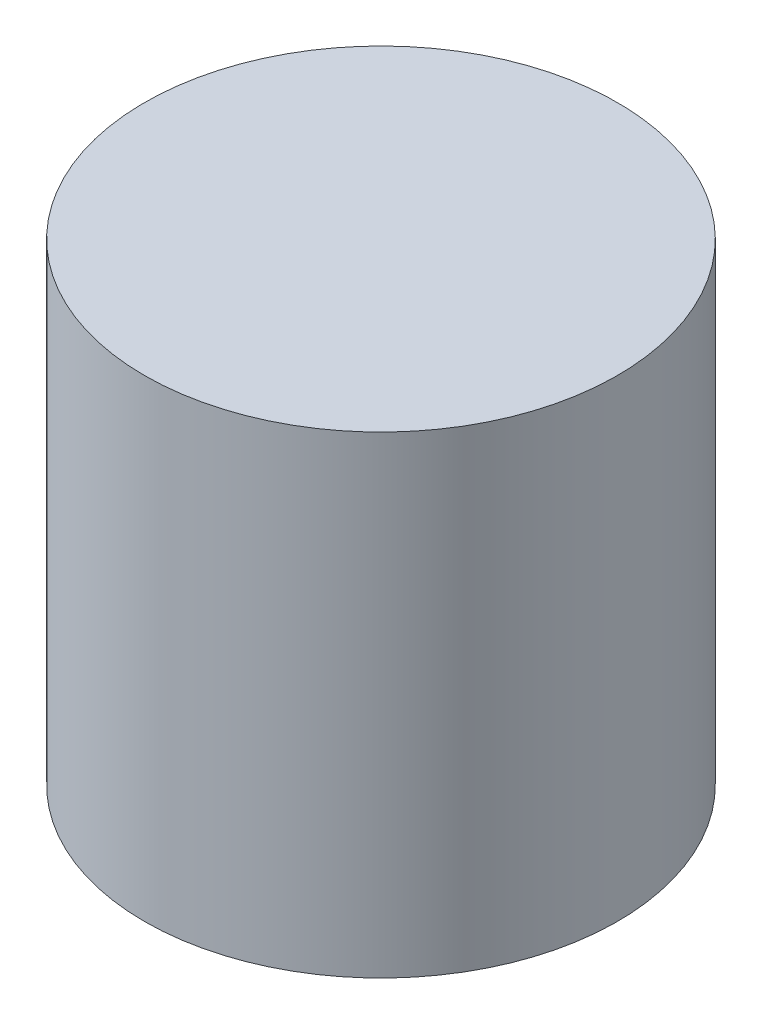
ISO-10303-21;
HEADER;
FILE_DESCRIPTION(('STEP AP214'),'2;1');
FILE_NAME('part.step','',(''),(''),'','','');
FILE_SCHEMA(('AUTOMOTIVE_DESIGN { 1 0 10303 214 1 1 1 1 }'));
ENDSEC;
DATA;
#1=APPLICATION_CONTEXT('core data for automotive mechanical design processes');
#2=APPLICATION_PROTOCOL_DEFINITION('international standard','automotive_design',2000,#1);
#3=PRODUCT_CONTEXT('',#1,'mechanical');
#4=PRODUCT('Part','Part','',(#3));
#5=PRODUCT_RELATED_PRODUCT_CATEGORY('part','',(#4));
#6=PRODUCT_DEFINITION_FORMATION('','',#4);
#7=PRODUCT_DEFINITION_CONTEXT('part definition',#1,'design');
#8=PRODUCT_DEFINITION('design','',#6,#7);
#9=PRODUCT_DEFINITION_SHAPE('','',#8);
#10=(LENGTH_UNIT() NAMED_UNIT(*) SI_UNIT(.MILLI.,.METRE.));
#11=(NAMED_UNIT(*) PLANE_ANGLE_UNIT() SI_UNIT($,.RADIAN.));
#12=(NAMED_UNIT(*) SI_UNIT($,.STERADIAN.) SOLID_ANGLE_UNIT());
#13=UNCERTAINTY_MEASURE_WITH_UNIT(LENGTH_MEASURE(1.E-05),#10,'distance_accuracy_value','');
#14=(GEOMETRIC_REPRESENTATION_CONTEXT(3) GLOBAL_UNCERTAINTY_ASSIGNED_CONTEXT((#13)) GLOBAL_UNIT_ASSIGNED_CONTEXT((#10,
#11,#12)) REPRESENTATION_CONTEXT('',''));
#15=CARTESIAN_POINT('',(0.,0.,0.));
#16=DIRECTION('',(0.,0.,1.));
#17=DIRECTION('',(1.,0.,0.));
#18=AXIS2_PLACEMENT_3D('',#15,#16,#17);
#19=CARTESIAN_POINT('',(0.,2.,0.));
#20=DIRECTION('',(0.,-1.,0.));
#21=DIRECTION('',(0.,0.,-1.));
#22=AXIS2_PLACEMENT_3D('',#19,#20,#21);
#23=CYLINDRICAL_SURFACE('',#22,1.);
#24=CARTESIAN_POINT('',(0.,2.,0.));
#25=DIRECTION('',(0.,1.,0.));
#26=DIRECTION('',(0.,0.,1.));
#27=AXIS2_PLACEMENT_3D('',#24,#25,#26);
#28=CIRCLE('',#27,1.);
#29=CARTESIAN_POINT('',(0.,2.,1.));
#30=VERTEX_POINT('',#29);
#31=EDGE_CURVE('E10',#30,#30,#28,.T.);
#32=ORIENTED_EDGE('',*,*,#31,.F.);
#33=EDGE_LOOP('',(#32));
#34=FACE_BOUND('',#33,.T.);
#35=CARTESIAN_POINT('',(0.,0.,0.));
#36=DIRECTION('',(0.,1.,0.));
#37=DIRECTION('',(0.,0.,1.));
#38=AXIS2_PLACEMENT_3D('',#35,#36,#37);
#39=CIRCLE('',#38,1.);
#40=CARTESIAN_POINT('',(0.,0.,1.));
#41=VERTEX_POINT('',#40);
#42=EDGE_CURVE('E40',#41,#41,#39,.T.);
#43=ORIENTED_EDGE('',*,*,#42,.T.);
#44=EDGE_LOOP('',(#43));
#45=FACE_BOUND('',#44,.T.);
#46=ADVANCED_FACE('F37',(#34,#45),#23,.T.);
#47=CARTESIAN_POINT('',(0.,2.,0.));
#48=DIRECTION('',(0.,1.,0.));
#49=DIRECTION('',(0.,0.,1.));
#50=AXIS2_PLACEMENT_3D('',#47,#48,#49);
#51=PLANE('',#50);
#52=ORIENTED_EDGE('',*,*,#31,.T.);
#53=EDGE_LOOP('',(#52));
#54=FACE_BOUND('',#53,.T.);
#55=ADVANCED_FACE('F54',(#54),#51,.T.);
#56=CARTESIAN_POINT('',(0.,0.,0.));
#57=DIRECTION('',(0.,1.,0.));
#58=DIRECTION('',(0.,0.,1.));
#59=AXIS2_PLACEMENT_3D('',#56,#57,#58);
#60=PLANE('',#59);
#61=ORIENTED_EDGE('',*,*,#42,.F.);
#62=EDGE_LOOP('',(#61));
#63=FACE_BOUND('',#62,.T.);
#64=ADVANCED_FACE('F52',(#63),#60,.F.);
#65=CLOSED_SHELL('',(#46,#55,#64));
#66=MANIFOLD_SOLID_BREP('B2',#65);
#67=ADVANCED_BREP_SHAPE_REPRESENTATION('',(#18,#66),#14);
#68=SHAPE_DEFINITION_REPRESENTATION(#9,#67);
ENDSEC;
END-ISO-10303-21;
